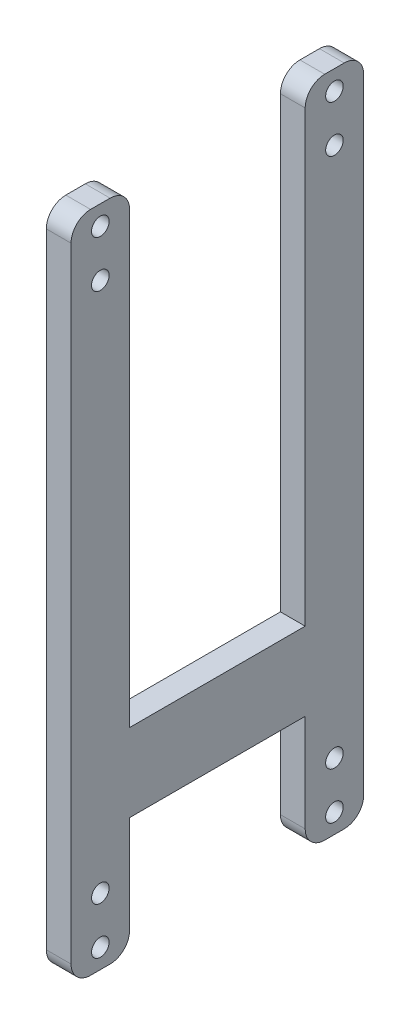
ISO-10303-21;
HEADER;
FILE_DESCRIPTION(('STEP AP214'),'2;1');
FILE_NAME('part.step','',(''),(''),'','','');
FILE_SCHEMA(('AUTOMOTIVE_DESIGN { 1 0 10303 214 1 1 1 1 }'));
ENDSEC;
DATA;
#1=APPLICATION_CONTEXT('core data for automotive mechanical design processes');
#2=APPLICATION_PROTOCOL_DEFINITION('international standard','automotive_design',2000,#1);
#3=PRODUCT_CONTEXT('',#1,'mechanical');
#4=PRODUCT('Part','Part','',(#3));
#5=PRODUCT_RELATED_PRODUCT_CATEGORY('part','',(#4));
#6=PRODUCT_DEFINITION_FORMATION('','',#4);
#7=PRODUCT_DEFINITION_CONTEXT('part definition',#1,'design');
#8=PRODUCT_DEFINITION('design','',#6,#7);
#9=PRODUCT_DEFINITION_SHAPE('','',#8);
#10=(LENGTH_UNIT() NAMED_UNIT(*) SI_UNIT(.MILLI.,.METRE.));
#11=(NAMED_UNIT(*) PLANE_ANGLE_UNIT() SI_UNIT($,.RADIAN.));
#12=(NAMED_UNIT(*) SI_UNIT($,.STERADIAN.) SOLID_ANGLE_UNIT());
#13=UNCERTAINTY_MEASURE_WITH_UNIT(LENGTH_MEASURE(1.E-05),#10,'distance_accuracy_value','');
#14=(GEOMETRIC_REPRESENTATION_CONTEXT(3) GLOBAL_UNCERTAINTY_ASSIGNED_CONTEXT((#13)) GLOBAL_UNIT_ASSIGNED_CONTEXT((#10,
#11,#12)) REPRESENTATION_CONTEXT('',''));
#15=CARTESIAN_POINT('',(0.,0.,0.));
#16=DIRECTION('',(0.,0.,1.));
#17=DIRECTION('',(1.,0.,0.));
#18=AXIS2_PLACEMENT_3D('',#15,#16,#17);
#19=CARTESIAN_POINT('',(6.35,85.,37.5));
#20=DIRECTION('',(0.,-1.,0.));
#21=DIRECTION('',(0.,0.,-1.));
#22=AXIS2_PLACEMENT_3D('',#19,#20,#21);
#23=PLANE('',#22);
#24=DIRECTION('',(0.,0.,1.));
#25=VECTOR('',#24,1.);
#26=CARTESIAN_POINT('',(6.35,85.,37.5));
#27=LINE('',#26,#25);
#28=CARTESIAN_POINT('',(6.35,85.,27.5));
#29=VERTEX_POINT('',#28);
#30=CARTESIAN_POINT('',(6.35,85.,32.4999999999999));
#31=VERTEX_POINT('',#30);
#32=EDGE_CURVE('E249',#29,#31,#27,.T.);
#33=ORIENTED_EDGE('',*,*,#32,.F.);
#34=DIRECTION('',(-1.,0.,0.));
#35=VECTOR('',#34,1.);
#36=CARTESIAN_POINT('',(6.35,85.,27.5));
#37=LINE('',#36,#35);
#38=CARTESIAN_POINT('',(0.,85.,27.5));
#39=VERTEX_POINT('',#38);
#40=EDGE_CURVE('E309',#29,#39,#37,.T.);
#41=ORIENTED_EDGE('',*,*,#40,.T.);
#42=DIRECTION('',(0.,0.,1.));
#43=VECTOR('',#42,1.);
#44=CARTESIAN_POINT('',(0.,85.,37.5));
#45=LINE('',#44,#43);
#46=CARTESIAN_POINT('',(0.,85.,32.4999999999999));
#47=VERTEX_POINT('',#46);
#48=EDGE_CURVE('E218',#39,#47,#45,.T.);
#49=ORIENTED_EDGE('',*,*,#48,.T.);
#50=DIRECTION('',(-1.,0.,0.));
#51=VECTOR('',#50,1.);
#52=CARTESIAN_POINT('',(6.35,85.,32.4999999999999));
#53=LINE('',#52,#51);
#54=EDGE_CURVE('E307',#47,#31,#53,.F.);
#55=ORIENTED_EDGE('',*,*,#54,.T.);
#56=EDGE_LOOP('',(#33,#41,#49,#55));
#57=FACE_BOUND('',#56,.T.);
#58=ADVANCED_FACE('F33',(#57),#23,.F.);
#59=CARTESIAN_POINT('',(6.35,-35.,37.5));
#60=DIRECTION('',(0.,0.,-1.));
#61=DIRECTION('',(0.,1.,0.));
#62=AXIS2_PLACEMENT_3D('',#59,#60,#61);
#63=PLANE('',#62);
#64=DIRECTION('',(0.,-1.,0.));
#65=VECTOR('',#64,1.);
#66=CARTESIAN_POINT('',(0.,-35.,37.5));
#67=LINE('',#66,#65);
#68=CARTESIAN_POINT('',(0.,80.,37.4999999999999));
#69=VERTEX_POINT('',#68);
#70=CARTESIAN_POINT('',(0.,-80.,37.5));
#71=VERTEX_POINT('',#70);
#72=EDGE_CURVE('E221',#69,#71,#67,.T.);
#73=ORIENTED_EDGE('',*,*,#72,.T.);
#74=DIRECTION('',(-1.,0.,0.));
#75=VECTOR('',#74,1.);
#76=CARTESIAN_POINT('',(6.35,-80.,37.5));
#77=LINE('',#76,#75);
#78=CARTESIAN_POINT('',(6.35,-80.,37.5));
#79=VERTEX_POINT('',#78);
#80=EDGE_CURVE('E11',#71,#79,#77,.F.);
#81=ORIENTED_EDGE('',*,*,#80,.T.);
#82=DIRECTION('',(0.,-1.,0.));
#83=VECTOR('',#82,1.);
#84=CARTESIAN_POINT('',(6.35,85.,37.5));
#85=LINE('',#84,#83);
#86=CARTESIAN_POINT('',(6.35,80.,37.5));
#87=VERTEX_POINT('',#86);
#88=EDGE_CURVE('E325',#87,#79,#85,.T.);
#89=ORIENTED_EDGE('',*,*,#88,.F.);
#90=DIRECTION('',(-1.,0.,0.));
#91=VECTOR('',#90,1.);
#92=CARTESIAN_POINT('',(6.35,80.,37.4999999999999));
#93=LINE('',#92,#91);
#94=EDGE_CURVE('E41',#87,#69,#93,.T.);
#95=ORIENTED_EDGE('',*,*,#94,.T.);
#96=EDGE_LOOP('',(#73,#81,#89,#95));
#97=FACE_BOUND('',#96,.T.);
#98=ADVANCED_FACE('F322',(#97),#63,.F.);
#99=CARTESIAN_POINT('',(6.35,-85.,37.5));
#100=DIRECTION('',(0.,1.,0.));
#101=DIRECTION('',(0.,0.,1.));
#102=AXIS2_PLACEMENT_3D('',#99,#100,#101);
#103=PLANE('',#102);
#104=DIRECTION('',(0.,0.,-1.));
#105=VECTOR('',#104,1.);
#106=CARTESIAN_POINT('',(0.,-85.,37.5));
#107=LINE('',#106,#105);
#108=CARTESIAN_POINT('',(0.,-85.,32.5));
#109=VERTEX_POINT('',#108);
#110=CARTESIAN_POINT('',(0.,-85.,27.5));
#111=VERTEX_POINT('',#110);
#112=EDGE_CURVE('E225',#109,#111,#107,.T.);
#113=ORIENTED_EDGE('',*,*,#112,.T.);
#114=DIRECTION('',(-1.,0.,0.));
#115=VECTOR('',#114,1.);
#116=CARTESIAN_POINT('',(6.35,-85.,27.5));
#117=LINE('',#116,#115);
#118=CARTESIAN_POINT('',(6.35,-85.,27.5));
#119=VERTEX_POINT('',#118);
#120=EDGE_CURVE('E297',#111,#119,#117,.F.);
#121=ORIENTED_EDGE('',*,*,#120,.T.);
#122=DIRECTION('',(0.,0.,-1.));
#123=VECTOR('',#122,1.);
#124=CARTESIAN_POINT('',(6.35,-85.,37.5));
#125=LINE('',#124,#123);
#126=CARTESIAN_POINT('',(6.35,-85.,32.5));
#127=VERTEX_POINT('',#126);
#128=EDGE_CURVE('E183',#127,#119,#125,.T.);
#129=ORIENTED_EDGE('',*,*,#128,.F.);
#130=DIRECTION('',(-1.,0.,0.));
#131=VECTOR('',#130,1.);
#132=CARTESIAN_POINT('',(6.35,-85.,32.5));
#133=LINE('',#132,#131);
#134=EDGE_CURVE('E294',#127,#109,#133,.T.);
#135=ORIENTED_EDGE('',*,*,#134,.T.);
#136=EDGE_LOOP('',(#113,#121,#129,#135));
#137=FACE_BOUND('',#136,.T.);
#138=ADVANCED_FACE('F339',(#137),#103,.F.);
#139=CARTESIAN_POINT('',(6.35,-85.,22.5));
#140=DIRECTION('',(0.,0.,1.));
#141=DIRECTION('',(0.,-1.,0.));
#142=AXIS2_PLACEMENT_3D('',#139,#140,#141);
#143=PLANE('',#142);
#144=DIRECTION('',(0.,1.,0.));
#145=VECTOR('',#144,1.);
#146=CARTESIAN_POINT('',(6.35,-85.,22.5));
#147=LINE('',#146,#145);
#148=CARTESIAN_POINT('',(6.35,-80.,22.5));
#149=VERTEX_POINT('',#148);
#150=CARTESIAN_POINT('',(6.35,-55.0000000000001,22.5));
#151=VERTEX_POINT('',#150);
#152=EDGE_CURVE('E170',#149,#151,#147,.T.);
#153=ORIENTED_EDGE('',*,*,#152,.F.);
#154=DIRECTION('',(-1.,0.,0.));
#155=VECTOR('',#154,1.);
#156=CARTESIAN_POINT('',(6.35,-80.,22.5));
#157=LINE('',#156,#155);
#158=CARTESIAN_POINT('',(0.,-80.,22.5));
#159=VERTEX_POINT('',#158);
#160=EDGE_CURVE('E292',#149,#159,#157,.T.);
#161=ORIENTED_EDGE('',*,*,#160,.T.);
#162=DIRECTION('',(0.,1.,0.));
#163=VECTOR('',#162,1.);
#164=CARTESIAN_POINT('',(0.,-85.,22.5));
#165=LINE('',#164,#163);
#166=CARTESIAN_POINT('',(0.,-55.0000000000001,22.5));
#167=VERTEX_POINT('',#166);
#168=EDGE_CURVE('E189',#159,#167,#165,.T.);
#169=ORIENTED_EDGE('',*,*,#168,.T.);
#170=DIRECTION('',(-1.,0.,0.));
#171=VECTOR('',#170,1.);
#172=CARTESIAN_POINT('',(6.35,-55.0000000000001,22.5));
#173=LINE('',#172,#171);
#174=EDGE_CURVE('E186',#151,#167,#173,.T.);
#175=ORIENTED_EDGE('',*,*,#174,.F.);
#176=EDGE_LOOP('',(#153,#161,#169,#175));
#177=FACE_BOUND('',#176,.T.);
#178=ADVANCED_FACE('F187',(#177),#143,.F.);
#179=CARTESIAN_POINT('',(6.35,-55.0000000000001,22.5));
#180=DIRECTION('',(0.,1.,0.));
#181=DIRECTION('',(0.,0.,1.));
#182=AXIS2_PLACEMENT_3D('',#179,#180,#181);
#183=PLANE('',#182);
#184=DIRECTION('',(0.,0.,-1.));
#185=VECTOR('',#184,1.);
#186=CARTESIAN_POINT('',(0.,-55.0000000000001,22.5));
#187=LINE('',#186,#185);
#188=CARTESIAN_POINT('',(0.,-55.0000000000001,-22.5));
#189=VERTEX_POINT('',#188);
#190=EDGE_CURVE('E229',#167,#189,#187,.T.);
#191=ORIENTED_EDGE('',*,*,#190,.T.);
#192=DIRECTION('',(-1.,0.,0.));
#193=VECTOR('',#192,1.);
#194=CARTESIAN_POINT('',(6.35,-55.0000000000001,-22.5));
#195=LINE('',#194,#193);
#196=CARTESIAN_POINT('',(6.35,-55.0000000000001,-22.5));
#197=VERTEX_POINT('',#196);
#198=EDGE_CURVE('E193',#197,#189,#195,.T.);
#199=ORIENTED_EDGE('',*,*,#198,.F.);
#200=DIRECTION('',(0.,0.,-1.));
#201=VECTOR('',#200,1.);
#202=CARTESIAN_POINT('',(6.35,-55.0000000000001,22.5));
#203=LINE('',#202,#201);
#204=EDGE_CURVE('E175',#151,#197,#203,.T.);
#205=ORIENTED_EDGE('',*,*,#204,.F.);
#206=ORIENTED_EDGE('',*,*,#174,.T.);
#207=EDGE_LOOP('',(#191,#199,#205,#206));
#208=FACE_BOUND('',#207,.T.);
#209=ADVANCED_FACE('F195',(#208),#183,.F.);
#210=CARTESIAN_POINT('',(6.35,-55.0000000000001,-22.5));
#211=DIRECTION('',(0.,0.,-1.));
#212=DIRECTION('',(0.,1.,0.));
#213=AXIS2_PLACEMENT_3D('',#210,#211,#212);
#214=PLANE('',#213);
#215=DIRECTION('',(0.,-1.,0.));
#216=VECTOR('',#215,1.);
#217=CARTESIAN_POINT('',(0.,-55.0000000000001,-22.5));
#218=LINE('',#217,#216);
#219=CARTESIAN_POINT('',(0.,-80.0000000000001,-22.5));
#220=VERTEX_POINT('',#219);
#221=EDGE_CURVE('E231',#189,#220,#218,.T.);
#222=ORIENTED_EDGE('',*,*,#221,.T.);
#223=DIRECTION('',(-1.,0.,0.));
#224=VECTOR('',#223,1.);
#225=CARTESIAN_POINT('',(6.35,-80.0000000000001,-22.5));
#226=LINE('',#225,#224);
#227=CARTESIAN_POINT('',(6.35,-80.0000000000001,-22.5));
#228=VERTEX_POINT('',#227);
#229=EDGE_CURVE('E276',#220,#228,#226,.F.);
#230=ORIENTED_EDGE('',*,*,#229,.T.);
#231=DIRECTION('',(0.,-1.,0.));
#232=VECTOR('',#231,1.);
#233=CARTESIAN_POINT('',(6.35,-55.0000000000001,-22.5));
#234=LINE('',#233,#232);
#235=EDGE_CURVE('E198',#197,#228,#234,.T.);
#236=ORIENTED_EDGE('',*,*,#235,.F.);
#237=ORIENTED_EDGE('',*,*,#198,.T.);
#238=EDGE_LOOP('',(#222,#230,#236,#237));
#239=FACE_BOUND('',#238,.T.);
#240=ADVANCED_FACE('F506',(#239),#214,.F.);
#241=CARTESIAN_POINT('',(6.35,-85.0000000000001,-22.5));
#242=DIRECTION('',(0.,1.,0.));
#243=DIRECTION('',(0.,0.,1.));
#244=AXIS2_PLACEMENT_3D('',#241,#242,#243);
#245=PLANE('',#244);
#246=DIRECTION('',(0.,0.,-1.));
#247=VECTOR('',#246,1.);
#248=CARTESIAN_POINT('',(6.35,-85.0000000000001,-22.5));
#249=LINE('',#248,#247);
#250=CARTESIAN_POINT('',(6.35,-85.0000000000001,-27.5));
#251=VERTEX_POINT('',#250);
#252=CARTESIAN_POINT('',(6.35,-85.,-32.5));
#253=VERTEX_POINT('',#252);
#254=EDGE_CURVE('E200',#251,#253,#249,.T.);
#255=ORIENTED_EDGE('',*,*,#254,.F.);
#256=DIRECTION('',(-1.,0.,0.));
#257=VECTOR('',#256,1.);
#258=CARTESIAN_POINT('',(6.35,-85.0000000000001,-27.5));
#259=LINE('',#258,#257);
#260=CARTESIAN_POINT('',(0.,-85.0000000000001,-27.5));
#261=VERTEX_POINT('',#260);
#262=EDGE_CURVE('E257',#251,#261,#259,.T.);
#263=ORIENTED_EDGE('',*,*,#262,.T.);
#264=DIRECTION('',(0.,0.,-1.));
#265=VECTOR('',#264,1.);
#266=CARTESIAN_POINT('',(0.,-85.0000000000001,-22.5));
#267=LINE('',#266,#265);
#268=CARTESIAN_POINT('',(0.,-85.,-32.5));
#269=VERTEX_POINT('',#268);
#270=EDGE_CURVE('E234',#261,#269,#267,.T.);
#271=ORIENTED_EDGE('',*,*,#270,.T.);
#272=DIRECTION('',(-1.,0.,0.));
#273=VECTOR('',#272,1.);
#274=CARTESIAN_POINT('',(6.35,-85.,-32.5));
#275=LINE('',#274,#273);
#276=EDGE_CURVE('E192',#269,#253,#275,.F.);
#277=ORIENTED_EDGE('',*,*,#276,.T.);
#278=EDGE_LOOP('',(#255,#263,#271,#277));
#279=FACE_BOUND('',#278,.T.);
#280=ADVANCED_FACE('F502',(#279),#245,.F.);
#281=CARTESIAN_POINT('',(6.35,85.,-37.5));
#282=DIRECTION('',(0.,0.,1.));
#283=DIRECTION('',(0.,-1.,0.));
#284=AXIS2_PLACEMENT_3D('',#281,#282,#283);
#285=PLANE('',#284);
#286=DIRECTION('',(0.,1.,0.));
#287=VECTOR('',#286,1.);
#288=CARTESIAN_POINT('',(6.35,-35.,-37.5));
#289=LINE('',#288,#287);
#290=CARTESIAN_POINT('',(6.35,-80.,-37.5));
#291=VERTEX_POINT('',#290);
#292=CARTESIAN_POINT('',(6.35,80.,-37.5));
#293=VERTEX_POINT('',#292);
#294=EDGE_CURVE('E206',#291,#293,#289,.T.);
#295=ORIENTED_EDGE('',*,*,#294,.F.);
#296=DIRECTION('',(-1.,0.,0.));
#297=VECTOR('',#296,1.);
#298=CARTESIAN_POINT('',(6.35,-80.,-37.5));
#299=LINE('',#298,#297);
#300=CARTESIAN_POINT('',(0.,-80.,-37.5));
#301=VERTEX_POINT('',#300);
#302=EDGE_CURVE('E315',#291,#301,#299,.T.);
#303=ORIENTED_EDGE('',*,*,#302,.T.);
#304=DIRECTION('',(0.,1.,0.));
#305=VECTOR('',#304,1.);
#306=CARTESIAN_POINT('',(0.,85.,-37.5));
#307=LINE('',#306,#305);
#308=CARTESIAN_POINT('',(0.,80.,-37.5));
#309=VERTEX_POINT('',#308);
#310=EDGE_CURVE('E237',#301,#309,#307,.T.);
#311=ORIENTED_EDGE('',*,*,#310,.T.);
#312=DIRECTION('',(-1.,0.,0.));
#313=VECTOR('',#312,1.);
#314=CARTESIAN_POINT('',(6.35,80.,-37.5));
#315=LINE('',#314,#313);
#316=EDGE_CURVE('E313',#309,#293,#315,.F.);
#317=ORIENTED_EDGE('',*,*,#316,.T.);
#318=EDGE_LOOP('',(#295,#303,#311,#317));
#319=FACE_BOUND('',#318,.T.);
#320=ADVANCED_FACE('F499',(#319),#285,.F.);
#321=CARTESIAN_POINT('',(6.35,85.0000000000001,-22.5));
#322=DIRECTION('',(0.,-1.,0.));
#323=DIRECTION('',(0.,0.,-1.));
#324=AXIS2_PLACEMENT_3D('',#321,#322,#323);
#325=PLANE('',#324);
#326=DIRECTION('',(0.,0.,1.));
#327=VECTOR('',#326,1.);
#328=CARTESIAN_POINT('',(0.,85.0000000000001,-22.5));
#329=LINE('',#328,#327);
#330=CARTESIAN_POINT('',(0.,85.,-32.5));
#331=VERTEX_POINT('',#330);
#332=CARTESIAN_POINT('',(0.,85.0000000000001,-27.5));
#333=VERTEX_POINT('',#332);
#334=EDGE_CURVE('E240',#331,#333,#329,.T.);
#335=ORIENTED_EDGE('',*,*,#334,.T.);
#336=DIRECTION('',(-1.,0.,0.));
#337=VECTOR('',#336,1.);
#338=CARTESIAN_POINT('',(6.35,85.0000000000001,-27.5));
#339=LINE('',#338,#337);
#340=CARTESIAN_POINT('',(6.35,85.0000000000001,-27.5));
#341=VERTEX_POINT('',#340);
#342=EDGE_CURVE('E305',#333,#341,#339,.F.);
#343=ORIENTED_EDGE('',*,*,#342,.T.);
#344=DIRECTION('',(0.,0.,1.));
#345=VECTOR('',#344,1.);
#346=CARTESIAN_POINT('',(6.35,85.0000000000001,-22.5));
#347=LINE('',#346,#345);
#348=CARTESIAN_POINT('',(6.35,85.,-32.5));
#349=VERTEX_POINT('',#348);
#350=EDGE_CURVE('E209',#349,#341,#347,.T.);
#351=ORIENTED_EDGE('',*,*,#350,.F.);
#352=DIRECTION('',(-1.,0.,0.));
#353=VECTOR('',#352,1.);
#354=CARTESIAN_POINT('',(6.35,85.,-32.5));
#355=LINE('',#354,#353);
#356=EDGE_CURVE('E302',#349,#331,#355,.T.);
#357=ORIENTED_EDGE('',*,*,#356,.T.);
#358=EDGE_LOOP('',(#335,#343,#351,#357));
#359=FACE_BOUND('',#358,.T.);
#360=ADVANCED_FACE('F468',(#359),#325,.F.);
#361=CARTESIAN_POINT('',(6.35,-34.9999999999999,-22.5));
#362=DIRECTION('',(0.,0.,-1.));
#363=DIRECTION('',(0.,1.,0.));
#364=AXIS2_PLACEMENT_3D('',#361,#362,#363);
#365=PLANE('',#364);
#366=DIRECTION('',(0.,-1.,0.));
#367=VECTOR('',#366,1.);
#368=CARTESIAN_POINT('',(6.35,-34.9999999999999,-22.5));
#369=LINE('',#368,#367);
#370=CARTESIAN_POINT('',(6.35,80.0000000000001,-22.5));
#371=VERTEX_POINT('',#370);
#372=CARTESIAN_POINT('',(6.35,-34.9999999999999,-22.5));
#373=VERTEX_POINT('',#372);
#374=EDGE_CURVE('E211',#371,#373,#369,.T.);
#375=ORIENTED_EDGE('',*,*,#374,.F.);
#376=DIRECTION('',(-1.,0.,0.));
#377=VECTOR('',#376,1.);
#378=CARTESIAN_POINT('',(6.35,80.0000000000001,-22.5));
#379=LINE('',#378,#377);
#380=CARTESIAN_POINT('',(0.,80.0000000000001,-22.5));
#381=VERTEX_POINT('',#380);
#382=EDGE_CURVE('E299',#371,#381,#379,.T.);
#383=ORIENTED_EDGE('',*,*,#382,.T.);
#384=DIRECTION('',(0.,-1.,0.));
#385=VECTOR('',#384,1.);
#386=CARTESIAN_POINT('',(0.,-34.9999999999999,-22.5));
#387=LINE('',#386,#385);
#388=CARTESIAN_POINT('',(0.,-34.9999999999999,-22.5));
#389=VERTEX_POINT('',#388);
#390=EDGE_CURVE('E243',#381,#389,#387,.T.);
#391=ORIENTED_EDGE('',*,*,#390,.T.);
#392=DIRECTION('',(-1.,0.,0.));
#393=VECTOR('',#392,1.);
#394=CARTESIAN_POINT('',(6.35,-34.9999999999999,-22.5));
#395=LINE('',#394,#393);
#396=EDGE_CURVE('E252',#373,#389,#395,.T.);
#397=ORIENTED_EDGE('',*,*,#396,.F.);
#398=EDGE_LOOP('',(#375,#383,#391,#397));
#399=FACE_BOUND('',#398,.T.);
#400=ADVANCED_FACE('F474',(#399),#365,.F.);
#401=CARTESIAN_POINT('',(6.35,-34.9999999999999,22.5));
#402=DIRECTION('',(0.,-1.,0.));
#403=DIRECTION('',(0.,0.,-1.));
#404=AXIS2_PLACEMENT_3D('',#401,#402,#403);
#405=PLANE('',#404);
#406=DIRECTION('',(0.,0.,1.));
#407=VECTOR('',#406,1.);
#408=CARTESIAN_POINT('',(0.,-34.9999999999999,22.5));
#409=LINE('',#408,#407);
#410=CARTESIAN_POINT('',(0.,-34.9999999999999,22.5));
#411=VERTEX_POINT('',#410);
#412=EDGE_CURVE('E245',#389,#411,#409,.T.);
#413=ORIENTED_EDGE('',*,*,#412,.T.);
#414=DIRECTION('',(-1.,0.,0.));
#415=VECTOR('',#414,1.);
#416=CARTESIAN_POINT('',(6.35,-34.9999999999999,22.5));
#417=LINE('',#416,#415);
#418=CARTESIAN_POINT('',(6.35,-34.9999999999999,22.5));
#419=VERTEX_POINT('',#418);
#420=EDGE_CURVE('E217',#419,#411,#417,.T.);
#421=ORIENTED_EDGE('',*,*,#420,.F.);
#422=DIRECTION('',(0.,0.,1.));
#423=VECTOR('',#422,1.);
#424=CARTESIAN_POINT('',(6.35,-34.9999999999999,22.5));
#425=LINE('',#424,#423);
#426=EDGE_CURVE('E213',#373,#419,#425,.T.);
#427=ORIENTED_EDGE('',*,*,#426,.F.);
#428=ORIENTED_EDGE('',*,*,#396,.T.);
#429=EDGE_LOOP('',(#413,#421,#427,#428));
#430=FACE_BOUND('',#429,.T.);
#431=ADVANCED_FACE('F480',(#430),#405,.F.);
#432=CARTESIAN_POINT('',(6.35,85.,22.5));
#433=DIRECTION('',(0.,0.,1.));
#434=DIRECTION('',(0.,-1.,0.));
#435=AXIS2_PLACEMENT_3D('',#432,#433,#434);
#436=PLANE('',#435);
#437=DIRECTION('',(0.,1.,0.));
#438=VECTOR('',#437,1.);
#439=CARTESIAN_POINT('',(0.,85.,22.5));
#440=LINE('',#439,#438);
#441=CARTESIAN_POINT('',(0.,80.,22.5));
#442=VERTEX_POINT('',#441);
#443=EDGE_CURVE('E247',#411,#442,#440,.T.);
#444=ORIENTED_EDGE('',*,*,#443,.T.);
#445=DIRECTION('',(-1.,0.,0.));
#446=VECTOR('',#445,1.);
#447=CARTESIAN_POINT('',(6.35,80.,22.5));
#448=LINE('',#447,#446);
#449=CARTESIAN_POINT('',(6.35,80.,22.5));
#450=VERTEX_POINT('',#449);
#451=EDGE_CURVE('E48',#442,#450,#448,.F.);
#452=ORIENTED_EDGE('',*,*,#451,.T.);
#453=DIRECTION('',(0.,1.,0.));
#454=VECTOR('',#453,1.);
#455=CARTESIAN_POINT('',(6.35,85.,22.5));
#456=LINE('',#455,#454);
#457=EDGE_CURVE('E215',#419,#450,#456,.T.);
#458=ORIENTED_EDGE('',*,*,#457,.F.);
#459=ORIENTED_EDGE('',*,*,#420,.T.);
#460=EDGE_LOOP('',(#444,#452,#458,#459));
#461=FACE_BOUND('',#460,.T.);
#462=ADVANCED_FACE('F482',(#461),#436,.F.);
#463=CARTESIAN_POINT('',(6.35,0.,0.));
#464=DIRECTION('',(-1.,0.,0.));
#465=DIRECTION('',(0.,0.,1.));
#466=AXIS2_PLACEMENT_3D('',#463,#464,#465);
#467=PLANE('',#466);
#468=CARTESIAN_POINT('',(6.35,68.,29.9999999999998));
#469=DIRECTION('',(-1.,0.,0.));
#470=DIRECTION('',(0.,0.,1.));
#471=AXIS2_PLACEMENT_3D('',#468,#469,#470);
#472=CIRCLE('',#471,2.25);
#473=CARTESIAN_POINT('',(6.35,68.,32.2499999999998));
#474=VERTEX_POINT('',#473);
#475=EDGE_CURVE('E386',#474,#474,#472,.T.);
#476=ORIENTED_EDGE('',*,*,#475,.T.);
#477=EDGE_LOOP('',(#476));
#478=FACE_BOUND('',#477,.T.);
#479=CARTESIAN_POINT('',(6.35,80.,29.9999999999998));
#480=DIRECTION('',(-1.,0.,0.));
#481=DIRECTION('',(0.,0.,1.));
#482=AXIS2_PLACEMENT_3D('',#479,#480,#481);
#483=CIRCLE('',#482,2.25);
#484=CARTESIAN_POINT('',(6.35,80.,32.2499999999998));
#485=VERTEX_POINT('',#484);
#486=EDGE_CURVE('E380',#485,#485,#483,.T.);
#487=ORIENTED_EDGE('',*,*,#486,.T.);
#488=EDGE_LOOP('',(#487));
#489=FACE_BOUND('',#488,.T.);
#490=CARTESIAN_POINT('',(6.35,68.,-29.9999999999998));
#491=DIRECTION('',(-1.,0.,0.));
#492=DIRECTION('',(0.,0.,1.));
#493=AXIS2_PLACEMENT_3D('',#490,#491,#492);
#494=CIRCLE('',#493,2.25);
#495=CARTESIAN_POINT('',(6.35,68.,-27.7499999999998));
#496=VERTEX_POINT('',#495);
#497=EDGE_CURVE('E374',#496,#496,#494,.T.);
#498=ORIENTED_EDGE('',*,*,#497,.T.);
#499=EDGE_LOOP('',(#498));
#500=FACE_BOUND('',#499,.T.);
#501=CARTESIAN_POINT('',(6.35,80.,-29.9999999999998));
#502=DIRECTION('',(-1.,0.,0.));
#503=DIRECTION('',(0.,0.,1.));
#504=AXIS2_PLACEMENT_3D('',#501,#502,#503);
#505=CIRCLE('',#504,2.25);
#506=CARTESIAN_POINT('',(6.35,80.,-27.7499999999998));
#507=VERTEX_POINT('',#506);
#508=EDGE_CURVE('E368',#507,#507,#505,.T.);
#509=ORIENTED_EDGE('',*,*,#508,.T.);
#510=EDGE_LOOP('',(#509));
#511=FACE_BOUND('',#510,.T.);
#512=CARTESIAN_POINT('',(6.35,-80.,29.9999999999997));
#513=DIRECTION('',(-1.,0.,0.));
#514=DIRECTION('',(0.,0.,1.));
#515=AXIS2_PLACEMENT_3D('',#512,#513,#514);
#516=CIRCLE('',#515,2.25);
#517=CARTESIAN_POINT('',(6.35,-80.,32.2499999999998));
#518=VERTEX_POINT('',#517);
#519=EDGE_CURVE('E362',#518,#518,#516,.T.);
#520=ORIENTED_EDGE('',*,*,#519,.T.);
#521=EDGE_LOOP('',(#520));
#522=FACE_BOUND('',#521,.T.);
#523=CARTESIAN_POINT('',(6.35,-68.,29.9999999999997));
#524=DIRECTION('',(-1.,0.,0.));
#525=DIRECTION('',(0.,0.,1.));
#526=AXIS2_PLACEMENT_3D('',#523,#524,#525);
#527=CIRCLE('',#526,2.25);
#528=CARTESIAN_POINT('',(6.35,-68.,32.2499999999998));
#529=VERTEX_POINT('',#528);
#530=EDGE_CURVE('E356',#529,#529,#527,.T.);
#531=ORIENTED_EDGE('',*,*,#530,.T.);
#532=EDGE_LOOP('',(#531));
#533=FACE_BOUND('',#532,.T.);
#534=CARTESIAN_POINT('',(6.35,-80.0000000000001,-29.9999999999997));
#535=DIRECTION('',(-1.,0.,0.));
#536=DIRECTION('',(0.,0.,1.));
#537=AXIS2_PLACEMENT_3D('',#534,#535,#536);
#538=CIRCLE('',#537,2.25);
#539=CARTESIAN_POINT('',(6.35,-80.0000000000001,-27.7499999999997));
#540=VERTEX_POINT('',#539);
#541=EDGE_CURVE('E350',#540,#540,#538,.T.);
#542=ORIENTED_EDGE('',*,*,#541,.T.);
#543=EDGE_LOOP('',(#542));
#544=FACE_BOUND('',#543,.T.);
#545=CARTESIAN_POINT('',(6.35,-68.,-29.9999999999997));
#546=DIRECTION('',(-1.,0.,0.));
#547=DIRECTION('',(0.,0.,1.));
#548=AXIS2_PLACEMENT_3D('',#545,#546,#547);
#549=CIRCLE('',#548,2.25);
#550=CARTESIAN_POINT('',(6.35,-68.,-27.7499999999997));
#551=VERTEX_POINT('',#550);
#552=EDGE_CURVE('E222',#551,#551,#549,.T.);
#553=ORIENTED_EDGE('',*,*,#552,.T.);
#554=EDGE_LOOP('',(#553));
#555=FACE_BOUND('',#554,.T.);
#556=ORIENTED_EDGE('',*,*,#235,.T.);
#557=CARTESIAN_POINT('',(6.35,-80.0000000000001,-27.5));
#558=DIRECTION('',(-1.,0.,0.));
#559=DIRECTION('',(0.,0.,1.));
#560=AXIS2_PLACEMENT_3D('',#557,#558,#559);
#561=CIRCLE('',#560,5.);
#562=EDGE_CURVE('E290',#228,#251,#561,.F.);
#563=ORIENTED_EDGE('',*,*,#562,.T.);
#564=ORIENTED_EDGE('',*,*,#254,.T.);
#565=CARTESIAN_POINT('',(6.35,-80.,-32.5));
#566=DIRECTION('',(-1.,0.,0.));
#567=DIRECTION('',(0.,0.,1.));
#568=AXIS2_PLACEMENT_3D('',#565,#566,#567);
#569=CIRCLE('',#568,5.);
#570=EDGE_CURVE('E284',#253,#291,#569,.F.);
#571=ORIENTED_EDGE('',*,*,#570,.T.);
#572=ORIENTED_EDGE('',*,*,#294,.T.);
#573=CARTESIAN_POINT('',(6.35,80.,-32.5));
#574=DIRECTION('',(-1.,0.,0.));
#575=DIRECTION('',(0.,0.,1.));
#576=AXIS2_PLACEMENT_3D('',#573,#574,#575);
#577=CIRCLE('',#576,5.);
#578=EDGE_CURVE('E280',#293,#349,#577,.F.);
#579=ORIENTED_EDGE('',*,*,#578,.T.);
#580=ORIENTED_EDGE('',*,*,#350,.T.);
#581=CARTESIAN_POINT('',(6.35,80.0000000000001,-27.5));
#582=DIRECTION('',(-1.,0.,0.));
#583=DIRECTION('',(0.,0.,1.));
#584=AXIS2_PLACEMENT_3D('',#581,#582,#583);
#585=CIRCLE('',#584,5.);
#586=EDGE_CURVE('E56',#341,#371,#585,.F.);
#587=ORIENTED_EDGE('',*,*,#586,.T.);
#588=ORIENTED_EDGE('',*,*,#374,.T.);
#589=ORIENTED_EDGE('',*,*,#426,.T.);
#590=ORIENTED_EDGE('',*,*,#457,.T.);
#591=CARTESIAN_POINT('',(6.35,80.,27.5));
#592=DIRECTION('',(-1.,0.,0.));
#593=DIRECTION('',(0.,0.,1.));
#594=AXIS2_PLACEMENT_3D('',#591,#592,#593);
#595=CIRCLE('',#594,5.);
#596=EDGE_CURVE('E286',#450,#29,#595,.F.);
#597=ORIENTED_EDGE('',*,*,#596,.T.);
#598=ORIENTED_EDGE('',*,*,#32,.T.);
#599=CARTESIAN_POINT('',(6.35,80.,32.4999999999999));
#600=DIRECTION('',(-1.,0.,0.));
#601=DIRECTION('',(0.,0.,1.));
#602=AXIS2_PLACEMENT_3D('',#599,#600,#601);
#603=CIRCLE('',#602,5.);
#604=EDGE_CURVE('E278',#31,#87,#603,.F.);
#605=ORIENTED_EDGE('',*,*,#604,.T.);
#606=ORIENTED_EDGE('',*,*,#88,.T.);
#607=CARTESIAN_POINT('',(6.35,-80.,32.5));
#608=DIRECTION('',(-1.,0.,0.));
#609=DIRECTION('',(0.,0.,1.));
#610=AXIS2_PLACEMENT_3D('',#607,#608,#609);
#611=CIRCLE('',#610,5.);
#612=EDGE_CURVE('E282',#79,#127,#611,.F.);
#613=ORIENTED_EDGE('',*,*,#612,.T.);
#614=ORIENTED_EDGE('',*,*,#128,.T.);
#615=CARTESIAN_POINT('',(6.35,-80.,27.5));
#616=DIRECTION('',(-1.,0.,0.));
#617=DIRECTION('',(0.,0.,1.));
#618=AXIS2_PLACEMENT_3D('',#615,#616,#617);
#619=CIRCLE('',#618,5.);
#620=EDGE_CURVE('E179',#119,#149,#619,.F.);
#621=ORIENTED_EDGE('',*,*,#620,.T.);
#622=ORIENTED_EDGE('',*,*,#152,.T.);
#623=ORIENTED_EDGE('',*,*,#204,.T.);
#624=EDGE_LOOP('',(#556,#563,#564,#571,#572,#579,#580,#587,#588,#589,#590,#597,#598,#605,#606,
#613,#614,#621,#622,#623));
#625=FACE_BOUND('',#624,.T.);
#626=ADVANCED_FACE('F173',(#478,#489,#500,#511,#522,#533,#544,#555,#625),#467,.F.);
#627=CARTESIAN_POINT('',(0.,0.,0.));
#628=DIRECTION('',(-1.,0.,0.));
#629=DIRECTION('',(0.,0.,1.));
#630=AXIS2_PLACEMENT_3D('',#627,#628,#629);
#631=PLANE('',#630);
#632=CARTESIAN_POINT('',(0.,68.,29.9999999999998));
#633=DIRECTION('',(-1.,0.,0.));
#634=DIRECTION('',(0.,0.,1.));
#635=AXIS2_PLACEMENT_3D('',#632,#633,#634);
#636=CIRCLE('',#635,2.25);
#637=CARTESIAN_POINT('',(0.,68.,32.2499999999998));
#638=VERTEX_POINT('',#637);
#639=EDGE_CURVE('E389',#638,#638,#636,.T.);
#640=ORIENTED_EDGE('',*,*,#639,.F.);
#641=EDGE_LOOP('',(#640));
#642=FACE_BOUND('',#641,.T.);
#643=CARTESIAN_POINT('',(0.,80.,29.9999999999998));
#644=DIRECTION('',(-1.,0.,0.));
#645=DIRECTION('',(0.,0.,1.));
#646=AXIS2_PLACEMENT_3D('',#643,#644,#645);
#647=CIRCLE('',#646,2.25);
#648=CARTESIAN_POINT('',(0.,80.,32.2499999999998));
#649=VERTEX_POINT('',#648);
#650=EDGE_CURVE('E383',#649,#649,#647,.T.);
#651=ORIENTED_EDGE('',*,*,#650,.F.);
#652=EDGE_LOOP('',(#651));
#653=FACE_BOUND('',#652,.T.);
#654=CARTESIAN_POINT('',(0.,68.,-29.9999999999998));
#655=DIRECTION('',(-1.,0.,0.));
#656=DIRECTION('',(0.,0.,1.));
#657=AXIS2_PLACEMENT_3D('',#654,#655,#656);
#658=CIRCLE('',#657,2.25);
#659=CARTESIAN_POINT('',(0.,68.,-27.7499999999998));
#660=VERTEX_POINT('',#659);
#661=EDGE_CURVE('E377',#660,#660,#658,.T.);
#662=ORIENTED_EDGE('',*,*,#661,.F.);
#663=EDGE_LOOP('',(#662));
#664=FACE_BOUND('',#663,.T.);
#665=CARTESIAN_POINT('',(0.,80.,-29.9999999999998));
#666=DIRECTION('',(-1.,0.,0.));
#667=DIRECTION('',(0.,0.,1.));
#668=AXIS2_PLACEMENT_3D('',#665,#666,#667);
#669=CIRCLE('',#668,2.25);
#670=CARTESIAN_POINT('',(0.,80.,-27.7499999999998));
#671=VERTEX_POINT('',#670);
#672=EDGE_CURVE('E371',#671,#671,#669,.T.);
#673=ORIENTED_EDGE('',*,*,#672,.F.);
#674=EDGE_LOOP('',(#673));
#675=FACE_BOUND('',#674,.T.);
#676=CARTESIAN_POINT('',(0.,-80.,29.9999999999997));
#677=DIRECTION('',(-1.,0.,0.));
#678=DIRECTION('',(0.,0.,1.));
#679=AXIS2_PLACEMENT_3D('',#676,#677,#678);
#680=CIRCLE('',#679,2.25);
#681=CARTESIAN_POINT('',(0.,-80.,32.2499999999998));
#682=VERTEX_POINT('',#681);
#683=EDGE_CURVE('E365',#682,#682,#680,.T.);
#684=ORIENTED_EDGE('',*,*,#683,.F.);
#685=EDGE_LOOP('',(#684));
#686=FACE_BOUND('',#685,.T.);
#687=CARTESIAN_POINT('',(0.,-68.,29.9999999999997));
#688=DIRECTION('',(-1.,0.,0.));
#689=DIRECTION('',(0.,0.,1.));
#690=AXIS2_PLACEMENT_3D('',#687,#688,#689);
#691=CIRCLE('',#690,2.25);
#692=CARTESIAN_POINT('',(0.,-68.,32.2499999999998));
#693=VERTEX_POINT('',#692);
#694=EDGE_CURVE('E359',#693,#693,#691,.T.);
#695=ORIENTED_EDGE('',*,*,#694,.F.);
#696=EDGE_LOOP('',(#695));
#697=FACE_BOUND('',#696,.T.);
#698=CARTESIAN_POINT('',(0.,-80.0000000000001,-29.9999999999997));
#699=DIRECTION('',(-1.,0.,0.));
#700=DIRECTION('',(0.,0.,1.));
#701=AXIS2_PLACEMENT_3D('',#698,#699,#700);
#702=CIRCLE('',#701,2.25);
#703=CARTESIAN_POINT('',(0.,-80.0000000000001,-27.7499999999997));
#704=VERTEX_POINT('',#703);
#705=EDGE_CURVE('E353',#704,#704,#702,.T.);
#706=ORIENTED_EDGE('',*,*,#705,.F.);
#707=EDGE_LOOP('',(#706));
#708=FACE_BOUND('',#707,.T.);
#709=CARTESIAN_POINT('',(0.,-68.,-29.9999999999997));
#710=DIRECTION('',(-1.,0.,0.));
#711=DIRECTION('',(0.,0.,1.));
#712=AXIS2_PLACEMENT_3D('',#709,#710,#711);
#713=CIRCLE('',#712,2.25);
#714=CARTESIAN_POINT('',(0.,-68.,-27.7499999999997));
#715=VERTEX_POINT('',#714);
#716=EDGE_CURVE('E347',#715,#715,#713,.T.);
#717=ORIENTED_EDGE('',*,*,#716,.F.);
#718=EDGE_LOOP('',(#717));
#719=FACE_BOUND('',#718,.T.);
#720=ORIENTED_EDGE('',*,*,#270,.F.);
#721=CARTESIAN_POINT('',(0.,-80.0000000000001,-27.5));
#722=DIRECTION('',(-1.,0.,0.));
#723=DIRECTION('',(0.,0.,1.));
#724=AXIS2_PLACEMENT_3D('',#721,#722,#723);
#725=CIRCLE('',#724,5.);
#726=EDGE_CURVE('E274',#261,#220,#725,.T.);
#727=ORIENTED_EDGE('',*,*,#726,.T.);
#728=ORIENTED_EDGE('',*,*,#221,.F.);
#729=ORIENTED_EDGE('',*,*,#190,.F.);
#730=ORIENTED_EDGE('',*,*,#168,.F.);
#731=CARTESIAN_POINT('',(0.,-80.,27.5));
#732=DIRECTION('',(-1.,0.,0.));
#733=DIRECTION('',(0.,0.,1.));
#734=AXIS2_PLACEMENT_3D('',#731,#732,#733);
#735=CIRCLE('',#734,5.);
#736=EDGE_CURVE('E272',#159,#111,#735,.T.);
#737=ORIENTED_EDGE('',*,*,#736,.T.);
#738=ORIENTED_EDGE('',*,*,#112,.F.);
#739=CARTESIAN_POINT('',(0.,-80.,32.5));
#740=DIRECTION('',(-1.,0.,0.));
#741=DIRECTION('',(0.,0.,1.));
#742=AXIS2_PLACEMENT_3D('',#739,#740,#741);
#743=CIRCLE('',#742,5.);
#744=EDGE_CURVE('E264',#109,#71,#743,.T.);
#745=ORIENTED_EDGE('',*,*,#744,.T.);
#746=ORIENTED_EDGE('',*,*,#72,.F.);
#747=CARTESIAN_POINT('',(0.,80.,32.4999999999999));
#748=DIRECTION('',(-1.,0.,0.));
#749=DIRECTION('',(0.,0.,1.));
#750=AXIS2_PLACEMENT_3D('',#747,#748,#749);
#751=CIRCLE('',#750,5.);
#752=EDGE_CURVE('E260',#69,#47,#751,.T.);
#753=ORIENTED_EDGE('',*,*,#752,.T.);
#754=ORIENTED_EDGE('',*,*,#48,.F.);
#755=CARTESIAN_POINT('',(0.,80.,27.5));
#756=DIRECTION('',(-1.,0.,0.));
#757=DIRECTION('',(0.,0.,1.));
#758=AXIS2_PLACEMENT_3D('',#755,#756,#757);
#759=CIRCLE('',#758,5.);
#760=EDGE_CURVE('E268',#39,#442,#759,.T.);
#761=ORIENTED_EDGE('',*,*,#760,.T.);
#762=ORIENTED_EDGE('',*,*,#443,.F.);
#763=ORIENTED_EDGE('',*,*,#412,.F.);
#764=ORIENTED_EDGE('',*,*,#390,.F.);
#765=CARTESIAN_POINT('',(0.,80.0000000000001,-27.5));
#766=DIRECTION('',(-1.,0.,0.));
#767=DIRECTION('',(0.,0.,1.));
#768=AXIS2_PLACEMENT_3D('',#765,#766,#767);
#769=CIRCLE('',#768,5.);
#770=EDGE_CURVE('E270',#381,#333,#769,.T.);
#771=ORIENTED_EDGE('',*,*,#770,.T.);
#772=ORIENTED_EDGE('',*,*,#334,.F.);
#773=CARTESIAN_POINT('',(0.,80.,-32.5));
#774=DIRECTION('',(-1.,0.,0.));
#775=DIRECTION('',(0.,0.,1.));
#776=AXIS2_PLACEMENT_3D('',#773,#774,#775);
#777=CIRCLE('',#776,5.);
#778=EDGE_CURVE('E262',#331,#309,#777,.T.);
#779=ORIENTED_EDGE('',*,*,#778,.T.);
#780=ORIENTED_EDGE('',*,*,#310,.F.);
#781=CARTESIAN_POINT('',(0.,-80.,-32.5));
#782=DIRECTION('',(-1.,0.,0.));
#783=DIRECTION('',(0.,0.,1.));
#784=AXIS2_PLACEMENT_3D('',#781,#782,#783);
#785=CIRCLE('',#784,5.);
#786=EDGE_CURVE('E266',#301,#269,#785,.T.);
#787=ORIENTED_EDGE('',*,*,#786,.T.);
#788=EDGE_LOOP('',(#720,#727,#728,#729,#730,#737,#738,#745,#746,#753,#754,#761,#762,#763,#764,
#771,#772,#779,#780,#787));
#789=FACE_BOUND('',#788,.T.);
#790=ADVANCED_FACE('F330',(#642,#653,#664,#675,#686,#697,#708,#719,#789),#631,.T.);
#791=CARTESIAN_POINT('',(0.,-68.,-29.9999999999997));
#792=DIRECTION('',(-1.,0.,0.));
#793=DIRECTION('',(0.,0.,1.));
#794=AXIS2_PLACEMENT_3D('',#791,#792,#793);
#795=CYLINDRICAL_SURFACE('',#794,2.25);
#796=ORIENTED_EDGE('',*,*,#552,.F.);
#797=EDGE_LOOP('',(#796));
#798=FACE_BOUND('',#797,.T.);
#799=ORIENTED_EDGE('',*,*,#716,.T.);
#800=EDGE_LOOP('',(#799));
#801=FACE_BOUND('',#800,.T.);
#802=ADVANCED_FACE('F397',(#798,#801),#795,.F.);
#803=CARTESIAN_POINT('',(0.,-80.0000000000001,-29.9999999999997));
#804=DIRECTION('',(-1.,0.,0.));
#805=DIRECTION('',(0.,0.,1.));
#806=AXIS2_PLACEMENT_3D('',#803,#804,#805);
#807=CYLINDRICAL_SURFACE('',#806,2.25);
#808=ORIENTED_EDGE('',*,*,#541,.F.);
#809=EDGE_LOOP('',(#808));
#810=FACE_BOUND('',#809,.T.);
#811=ORIENTED_EDGE('',*,*,#705,.T.);
#812=EDGE_LOOP('',(#811));
#813=FACE_BOUND('',#812,.T.);
#814=ADVANCED_FACE('F414',(#810,#813),#807,.F.);
#815=CARTESIAN_POINT('',(0.,-68.,29.9999999999997));
#816=DIRECTION('',(-1.,0.,0.));
#817=DIRECTION('',(0.,0.,1.));
#818=AXIS2_PLACEMENT_3D('',#815,#816,#817);
#819=CYLINDRICAL_SURFACE('',#818,2.25);
#820=ORIENTED_EDGE('',*,*,#530,.F.);
#821=EDGE_LOOP('',(#820));
#822=FACE_BOUND('',#821,.T.);
#823=ORIENTED_EDGE('',*,*,#694,.T.);
#824=EDGE_LOOP('',(#823));
#825=FACE_BOUND('',#824,.T.);
#826=ADVANCED_FACE('F420',(#822,#825),#819,.F.);
#827=CARTESIAN_POINT('',(0.,-80.,29.9999999999997));
#828=DIRECTION('',(-1.,0.,0.));
#829=DIRECTION('',(0.,0.,1.));
#830=AXIS2_PLACEMENT_3D('',#827,#828,#829);
#831=CYLINDRICAL_SURFACE('',#830,2.25);
#832=ORIENTED_EDGE('',*,*,#519,.F.);
#833=EDGE_LOOP('',(#832));
#834=FACE_BOUND('',#833,.T.);
#835=ORIENTED_EDGE('',*,*,#683,.T.);
#836=EDGE_LOOP('',(#835));
#837=FACE_BOUND('',#836,.T.);
#838=ADVANCED_FACE('F572',(#834,#837),#831,.F.);
#839=CARTESIAN_POINT('',(0.,80.,-29.9999999999998));
#840=DIRECTION('',(-1.,0.,0.));
#841=DIRECTION('',(0.,0.,1.));
#842=AXIS2_PLACEMENT_3D('',#839,#840,#841);
#843=CYLINDRICAL_SURFACE('',#842,2.25);
#844=ORIENTED_EDGE('',*,*,#508,.F.);
#845=EDGE_LOOP('',(#844));
#846=FACE_BOUND('',#845,.T.);
#847=ORIENTED_EDGE('',*,*,#672,.T.);
#848=EDGE_LOOP('',(#847));
#849=FACE_BOUND('',#848,.T.);
#850=ADVANCED_FACE('F582',(#846,#849),#843,.F.);
#851=CARTESIAN_POINT('',(0.,68.,-29.9999999999998));
#852=DIRECTION('',(-1.,0.,0.));
#853=DIRECTION('',(0.,0.,1.));
#854=AXIS2_PLACEMENT_3D('',#851,#852,#853);
#855=CYLINDRICAL_SURFACE('',#854,2.25);
#856=ORIENTED_EDGE('',*,*,#497,.F.);
#857=EDGE_LOOP('',(#856));
#858=FACE_BOUND('',#857,.T.);
#859=ORIENTED_EDGE('',*,*,#661,.T.);
#860=EDGE_LOOP('',(#859));
#861=FACE_BOUND('',#860,.T.);
#862=ADVANCED_FACE('F592',(#858,#861),#855,.F.);
#863=CARTESIAN_POINT('',(0.,80.,29.9999999999998));
#864=DIRECTION('',(-1.,0.,0.));
#865=DIRECTION('',(0.,0.,1.));
#866=AXIS2_PLACEMENT_3D('',#863,#864,#865);
#867=CYLINDRICAL_SURFACE('',#866,2.25);
#868=ORIENTED_EDGE('',*,*,#486,.F.);
#869=EDGE_LOOP('',(#868));
#870=FACE_BOUND('',#869,.T.);
#871=ORIENTED_EDGE('',*,*,#650,.T.);
#872=EDGE_LOOP('',(#871));
#873=FACE_BOUND('',#872,.T.);
#874=ADVANCED_FACE('F602',(#870,#873),#867,.F.);
#875=CARTESIAN_POINT('',(0.,68.,29.9999999999998));
#876=DIRECTION('',(-1.,0.,0.));
#877=DIRECTION('',(0.,0.,1.));
#878=AXIS2_PLACEMENT_3D('',#875,#876,#877);
#879=CYLINDRICAL_SURFACE('',#878,2.25);
#880=ORIENTED_EDGE('',*,*,#475,.F.);
#881=EDGE_LOOP('',(#880));
#882=FACE_BOUND('',#881,.T.);
#883=ORIENTED_EDGE('',*,*,#639,.T.);
#884=EDGE_LOOP('',(#883));
#885=FACE_BOUND('',#884,.T.);
#886=ADVANCED_FACE('F393',(#882,#885),#879,.F.);
#887=CARTESIAN_POINT('',(6.35,-80.0000000000001,-27.5));
#888=DIRECTION('',(-1.,0.,0.));
#889=DIRECTION('',(0.,0.,1.));
#890=AXIS2_PLACEMENT_3D('',#887,#888,#889);
#891=CYLINDRICAL_SURFACE('',#890,5.);
#892=ORIENTED_EDGE('',*,*,#562,.F.);
#893=ORIENTED_EDGE('',*,*,#229,.F.);
#894=ORIENTED_EDGE('',*,*,#726,.F.);
#895=ORIENTED_EDGE('',*,*,#262,.F.);
#896=EDGE_LOOP('',(#892,#893,#894,#895));
#897=FACE_BOUND('',#896,.T.);
#898=ADVANCED_FACE('F435',(#897),#891,.T.);
#899=CARTESIAN_POINT('',(6.35,-80.,27.5));
#900=DIRECTION('',(-1.,0.,0.));
#901=DIRECTION('',(0.,0.,1.));
#902=AXIS2_PLACEMENT_3D('',#899,#900,#901);
#903=CYLINDRICAL_SURFACE('',#902,5.);
#904=ORIENTED_EDGE('',*,*,#620,.F.);
#905=ORIENTED_EDGE('',*,*,#120,.F.);
#906=ORIENTED_EDGE('',*,*,#736,.F.);
#907=ORIENTED_EDGE('',*,*,#160,.F.);
#908=EDGE_LOOP('',(#904,#905,#906,#907));
#909=FACE_BOUND('',#908,.T.);
#910=ADVANCED_FACE('F438',(#909),#903,.T.);
#911=CARTESIAN_POINT('',(6.35,80.0000000000001,-27.5));
#912=DIRECTION('',(-1.,0.,0.));
#913=DIRECTION('',(0.,0.,1.));
#914=AXIS2_PLACEMENT_3D('',#911,#912,#913);
#915=CYLINDRICAL_SURFACE('',#914,5.);
#916=ORIENTED_EDGE('',*,*,#586,.F.);
#917=ORIENTED_EDGE('',*,*,#342,.F.);
#918=ORIENTED_EDGE('',*,*,#770,.F.);
#919=ORIENTED_EDGE('',*,*,#382,.F.);
#920=EDGE_LOOP('',(#916,#917,#918,#919));
#921=FACE_BOUND('',#920,.T.);
#922=ADVANCED_FACE('F442',(#921),#915,.T.);
#923=CARTESIAN_POINT('',(6.35,80.,27.5));
#924=DIRECTION('',(-1.,0.,0.));
#925=DIRECTION('',(0.,0.,1.));
#926=AXIS2_PLACEMENT_3D('',#923,#924,#925);
#927=CYLINDRICAL_SURFACE('',#926,5.);
#928=ORIENTED_EDGE('',*,*,#596,.F.);
#929=ORIENTED_EDGE('',*,*,#451,.F.);
#930=ORIENTED_EDGE('',*,*,#760,.F.);
#931=ORIENTED_EDGE('',*,*,#40,.F.);
#932=EDGE_LOOP('',(#928,#929,#930,#931));
#933=FACE_BOUND('',#932,.T.);
#934=ADVANCED_FACE('F446',(#933),#927,.T.);
#935=CARTESIAN_POINT('',(6.35,-80.,-32.5));
#936=DIRECTION('',(-1.,0.,0.));
#937=DIRECTION('',(0.,0.,1.));
#938=AXIS2_PLACEMENT_3D('',#935,#936,#937);
#939=CYLINDRICAL_SURFACE('',#938,5.);
#940=ORIENTED_EDGE('',*,*,#570,.F.);
#941=ORIENTED_EDGE('',*,*,#276,.F.);
#942=ORIENTED_EDGE('',*,*,#786,.F.);
#943=ORIENTED_EDGE('',*,*,#302,.F.);
#944=EDGE_LOOP('',(#940,#941,#942,#943));
#945=FACE_BOUND('',#944,.T.);
#946=ADVANCED_FACE('F450',(#945),#939,.T.);
#947=CARTESIAN_POINT('',(6.35,-80.,32.5));
#948=DIRECTION('',(-1.,0.,0.));
#949=DIRECTION('',(0.,0.,1.));
#950=AXIS2_PLACEMENT_3D('',#947,#948,#949);
#951=CYLINDRICAL_SURFACE('',#950,5.);
#952=ORIENTED_EDGE('',*,*,#612,.F.);
#953=ORIENTED_EDGE('',*,*,#80,.F.);
#954=ORIENTED_EDGE('',*,*,#744,.F.);
#955=ORIENTED_EDGE('',*,*,#134,.F.);
#956=EDGE_LOOP('',(#952,#953,#954,#955));
#957=FACE_BOUND('',#956,.T.);
#958=ADVANCED_FACE('F336',(#957),#951,.T.);
#959=CARTESIAN_POINT('',(6.35,80.,-32.5));
#960=DIRECTION('',(-1.,0.,0.));
#961=DIRECTION('',(0.,0.,1.));
#962=AXIS2_PLACEMENT_3D('',#959,#960,#961);
#963=CYLINDRICAL_SURFACE('',#962,5.);
#964=ORIENTED_EDGE('',*,*,#578,.F.);
#965=ORIENTED_EDGE('',*,*,#316,.F.);
#966=ORIENTED_EDGE('',*,*,#778,.F.);
#967=ORIENTED_EDGE('',*,*,#356,.F.);
#968=EDGE_LOOP('',(#964,#965,#966,#967));
#969=FACE_BOUND('',#968,.T.);
#970=ADVANCED_FACE('F456',(#969),#963,.T.);
#971=CARTESIAN_POINT('',(6.35,80.,32.4999999999999));
#972=DIRECTION('',(-1.,0.,0.));
#973=DIRECTION('',(0.,0.,1.));
#974=AXIS2_PLACEMENT_3D('',#971,#972,#973);
#975=CYLINDRICAL_SURFACE('',#974,5.);
#976=ORIENTED_EDGE('',*,*,#604,.F.);
#977=ORIENTED_EDGE('',*,*,#54,.F.);
#978=ORIENTED_EDGE('',*,*,#752,.F.);
#979=ORIENTED_EDGE('',*,*,#94,.F.);
#980=EDGE_LOOP('',(#976,#977,#978,#979));
#981=FACE_BOUND('',#980,.T.);
#982=ADVANCED_FACE('F35',(#981),#975,.T.);
#983=CLOSED_SHELL('',(#58,#98,#138,#178,#209,#240,#280,#320,#360,#400,#431,#462,#626,#790,#802,
#814,#826,#838,#850,#862,#874,#886,#898,#910,#922,#934,#946,#958,#970,#982));
#984=MANIFOLD_SOLID_BREP('B2',#983);
#985=ADVANCED_BREP_SHAPE_REPRESENTATION('',(#18,#984),#14);
#986=SHAPE_DEFINITION_REPRESENTATION(#9,#985);
ENDSEC;
END-ISO-10303-21;
